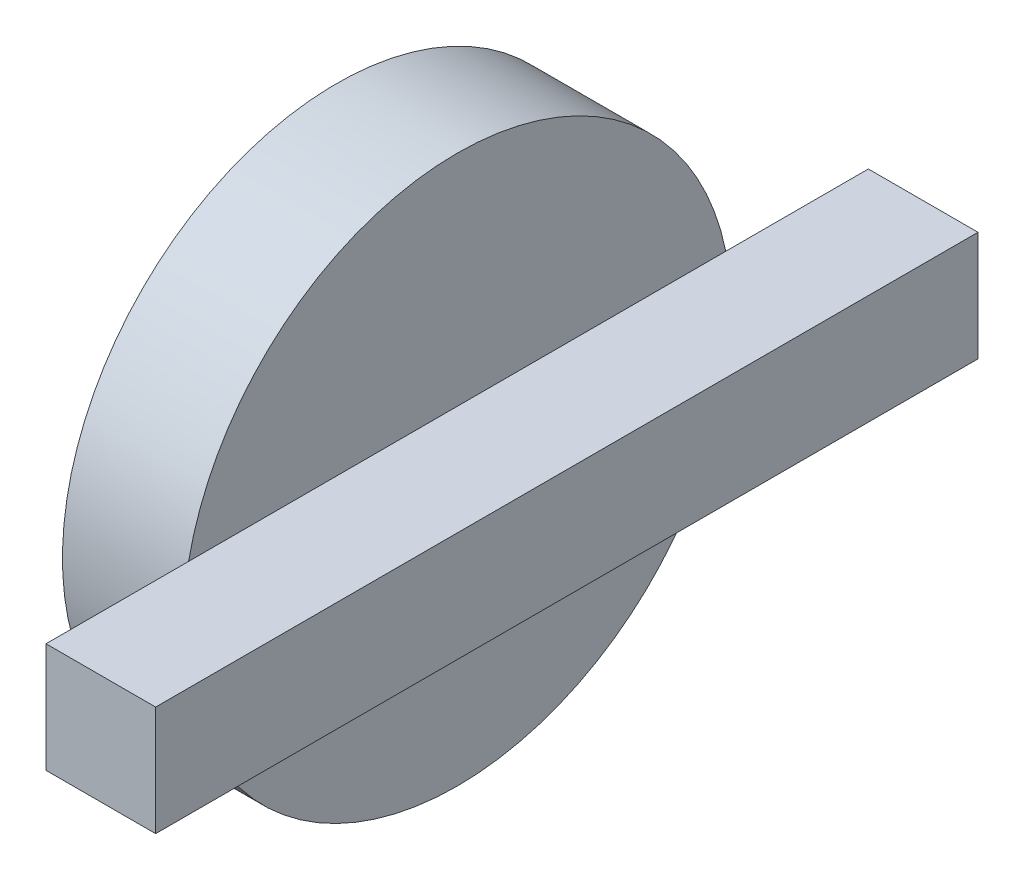
ISO-10303-21;
HEADER;
FILE_DESCRIPTION(('STEP AP214'),'2;1');
FILE_NAME('part.step','',(''),(''),'','','');
FILE_SCHEMA(('AUTOMOTIVE_DESIGN { 1 0 10303 214 1 1 1 1 }'));
ENDSEC;
DATA;
#1=APPLICATION_CONTEXT('core data for automotive mechanical design processes');
#2=APPLICATION_PROTOCOL_DEFINITION('international standard','automotive_design',2000,#1);
#3=PRODUCT_CONTEXT('',#1,'mechanical');
#4=PRODUCT('Part','Part','',(#3));
#5=PRODUCT_RELATED_PRODUCT_CATEGORY('part','',(#4));
#6=PRODUCT_DEFINITION_FORMATION('','',#4);
#7=PRODUCT_DEFINITION_CONTEXT('part definition',#1,'design');
#8=PRODUCT_DEFINITION('design','',#6,#7);
#9=PRODUCT_DEFINITION_SHAPE('','',#8);
#10=(LENGTH_UNIT() NAMED_UNIT(*) SI_UNIT(.MILLI.,.METRE.));
#11=(NAMED_UNIT(*) PLANE_ANGLE_UNIT() SI_UNIT($,.RADIAN.));
#12=(NAMED_UNIT(*) SI_UNIT($,.STERADIAN.) SOLID_ANGLE_UNIT());
#13=UNCERTAINTY_MEASURE_WITH_UNIT(LENGTH_MEASURE(1.E-05),#10,'distance_accuracy_value','');
#14=(GEOMETRIC_REPRESENTATION_CONTEXT(3) GLOBAL_UNCERTAINTY_ASSIGNED_CONTEXT((#13)) GLOBAL_UNIT_ASSIGNED_CONTEXT((#10,
#11,#12)) REPRESENTATION_CONTEXT('',''));
#15=CARTESIAN_POINT('',(0.,0.,0.));
#16=DIRECTION('',(0.,0.,1.));
#17=DIRECTION('',(1.,0.,0.));
#18=AXIS2_PLACEMENT_3D('',#15,#16,#17);
#19=CARTESIAN_POINT('',(11.,0.,0.));
#20=DIRECTION('',(1.,0.,0.));
#21=DIRECTION('',(0.,0.,-1.));
#22=AXIS2_PLACEMENT_3D('',#19,#20,#21);
#23=PLANE('',#22);
#24=DIRECTION('',(0.,0.,1.));
#25=VECTOR('',#24,1.);
#26=CARTESIAN_POINT('',(11.,9.99999999999998,75.));
#27=LINE('',#26,#25);
#28=CARTESIAN_POINT('',(11.,10.,-48.9897948556636));
#29=VERTEX_POINT('',#28);
#30=CARTESIAN_POINT('',(11.,9.99999999999998,48.9897948556636));
#31=VERTEX_POINT('',#30);
#32=EDGE_CURVE('E11',#29,#31,#27,.T.);
#33=ORIENTED_EDGE('',*,*,#32,.F.);
#34=CARTESIAN_POINT('',(11.,0.,0.));
#35=DIRECTION('',(1.,0.,0.));
#36=DIRECTION('',(0.,0.,-1.));
#37=AXIS2_PLACEMENT_3D('',#34,#35,#36);
#38=CIRCLE('',#37,50.);
#39=EDGE_CURVE('E142',#29,#31,#38,.T.);
#40=ORIENTED_EDGE('',*,*,#39,.T.);
#41=EDGE_LOOP('',(#33,#40));
#42=FACE_BOUND('',#41,.T.);
#43=ADVANCED_FACE('F43',(#42),#23,.T.);
#44=CARTESIAN_POINT('',(11.,0.,0.));
#45=DIRECTION('',(-1.,0.,0.));
#46=DIRECTION('',(0.,0.,1.));
#47=AXIS2_PLACEMENT_3D('',#44,#45,#46);
#48=CYLINDRICAL_SURFACE('',#47,50.);
#49=ORIENTED_EDGE('',*,*,#39,.F.);
#50=CARTESIAN_POINT('',(11.,-10.,-48.9897948556636));
#51=VERTEX_POINT('',#50);
#52=EDGE_CURVE('E144',#51,#29,#38,.T.);
#53=ORIENTED_EDGE('',*,*,#52,.F.);
#54=CARTESIAN_POINT('',(11.,-10.,48.9897948556636));
#55=VERTEX_POINT('',#54);
#56=EDGE_CURVE('E152',#55,#51,#38,.T.);
#57=ORIENTED_EDGE('',*,*,#56,.F.);
#58=EDGE_CURVE('E68',#31,#55,#38,.T.);
#59=ORIENTED_EDGE('',*,*,#58,.F.);
#60=EDGE_LOOP('',(#49,#53,#57,#59));
#61=FACE_BOUND('',#60,.T.);
#62=CARTESIAN_POINT('',(-11.,0.,0.));
#63=DIRECTION('',(1.,0.,0.));
#64=DIRECTION('',(0.,0.,-1.));
#65=AXIS2_PLACEMENT_3D('',#62,#63,#64);
#66=CIRCLE('',#65,50.);
#67=CARTESIAN_POINT('',(-11.,0.,-50.));
#68=VERTEX_POINT('',#67);
#69=EDGE_CURVE('E47',#68,#68,#66,.T.);
#70=ORIENTED_EDGE('',*,*,#69,.T.);
#71=EDGE_LOOP('',(#70));
#72=FACE_BOUND('',#71,.T.);
#73=ADVANCED_FACE('F45',(#61,#72),#48,.T.);
#74=DIRECTION('',(0.,0.,-1.));
#75=VECTOR('',#74,1.);
#76=CARTESIAN_POINT('',(11.,-10.,75.));
#77=LINE('',#76,#75);
#78=EDGE_CURVE('E53',#55,#51,#77,.T.);
#79=ORIENTED_EDGE('',*,*,#78,.F.);
#80=ORIENTED_EDGE('',*,*,#56,.T.);
#81=EDGE_LOOP('',(#79,#80));
#82=FACE_BOUND('',#81,.T.);
#83=ADVANCED_FACE('F169',(#82),#23,.T.);
#84=CARTESIAN_POINT('',(-11.,0.,0.));
#85=DIRECTION('',(1.,0.,0.));
#86=DIRECTION('',(0.,0.,-1.));
#87=AXIS2_PLACEMENT_3D('',#84,#85,#86);
#88=PLANE('',#87);
#89=CARTESIAN_POINT('',(-11.,0.,0.));
#90=DIRECTION('',(-1.,0.,0.));
#91=DIRECTION('',(0.,0.,1.));
#92=AXIS2_PLACEMENT_3D('',#89,#90,#91);
#93=CIRCLE('',#92,30.);
#94=CARTESIAN_POINT('',(-11.,0.,30.));
#95=VERTEX_POINT('',#94);
#96=EDGE_CURVE('E129',#95,#95,#93,.T.);
#97=ORIENTED_EDGE('',*,*,#96,.F.);
#98=EDGE_LOOP('',(#97));
#99=FACE_BOUND('',#98,.T.);
#100=ORIENTED_EDGE('',*,*,#69,.F.);
#101=EDGE_LOOP('',(#100));
#102=FACE_BOUND('',#101,.T.);
#103=ADVANCED_FACE('F166',(#99,#102),#88,.F.);
#104=CARTESIAN_POINT('',(1.,0.,0.));
#105=DIRECTION('',(-1.,0.,0.));
#106=DIRECTION('',(0.,0.,1.));
#107=AXIS2_PLACEMENT_3D('',#104,#105,#106);
#108=CYLINDRICAL_SURFACE('',#107,30.);
#109=CARTESIAN_POINT('',(1.,0.,0.));
#110=DIRECTION('',(-1.,0.,0.));
#111=DIRECTION('',(0.,0.,1.));
#112=AXIS2_PLACEMENT_3D('',#109,#110,#111);
#113=CIRCLE('',#112,30.);
#114=CARTESIAN_POINT('',(1.,0.,30.));
#115=VERTEX_POINT('',#114);
#116=EDGE_CURVE('E134',#115,#115,#113,.T.);
#117=ORIENTED_EDGE('',*,*,#116,.F.);
#118=EDGE_LOOP('',(#117));
#119=FACE_BOUND('',#118,.T.);
#120=ORIENTED_EDGE('',*,*,#96,.T.);
#121=EDGE_LOOP('',(#120));
#122=FACE_BOUND('',#121,.T.);
#123=ADVANCED_FACE('F168',(#119,#122),#108,.F.);
#124=CARTESIAN_POINT('',(1.,0.,0.));
#125=DIRECTION('',(-1.,0.,0.));
#126=DIRECTION('',(0.,0.,1.));
#127=AXIS2_PLACEMENT_3D('',#124,#125,#126);
#128=PLANE('',#127);
#129=ORIENTED_EDGE('',*,*,#116,.T.);
#130=EDGE_LOOP('',(#129));
#131=FACE_BOUND('',#130,.T.);
#132=ADVANCED_FACE('F175',(#131),#128,.T.);
#133=CARTESIAN_POINT('',(11.,0.,0.));
#134=DIRECTION('',(1.,0.,0.));
#135=DIRECTION('',(0.,0.,-1.));
#136=AXIS2_PLACEMENT_3D('',#133,#134,#135);
#137=PLANE('',#136);
#138=CARTESIAN_POINT('',(11.,9.99999999999998,75.));
#139=VERTEX_POINT('',#138);
#140=EDGE_CURVE('E56',#31,#139,#27,.T.);
#141=ORIENTED_EDGE('',*,*,#140,.F.);
#142=ORIENTED_EDGE('',*,*,#58,.T.);
#143=CARTESIAN_POINT('',(11.,-10.,75.));
#144=VERTEX_POINT('',#143);
#145=EDGE_CURVE('E150',#144,#55,#77,.T.);
#146=ORIENTED_EDGE('',*,*,#145,.F.);
#147=DIRECTION('',(0.,-1.,0.));
#148=VECTOR('',#147,1.);
#149=CARTESIAN_POINT('',(11.,9.99999999999998,75.));
#150=LINE('',#149,#148);
#151=EDGE_CURVE('E127',#139,#144,#150,.T.);
#152=ORIENTED_EDGE('',*,*,#151,.F.);
#153=EDGE_LOOP('',(#141,#142,#146,#152));
#154=FACE_BOUND('',#153,.T.);
#155=ADVANCED_FACE('F187',(#154),#137,.F.);
#156=CARTESIAN_POINT('',(11.,-10.,-75.));
#157=VERTEX_POINT('',#156);
#158=EDGE_CURVE('E151',#51,#157,#77,.T.);
#159=ORIENTED_EDGE('',*,*,#158,.F.);
#160=ORIENTED_EDGE('',*,*,#52,.T.);
#161=CARTESIAN_POINT('',(11.,10.,-75.));
#162=VERTEX_POINT('',#161);
#163=EDGE_CURVE('E55',#162,#29,#27,.T.);
#164=ORIENTED_EDGE('',*,*,#163,.F.);
#165=DIRECTION('',(0.,1.,0.));
#166=VECTOR('',#165,1.);
#167=CARTESIAN_POINT('',(11.,10.,-75.));
#168=LINE('',#167,#166);
#169=EDGE_CURVE('E308',#157,#162,#168,.T.);
#170=ORIENTED_EDGE('',*,*,#169,.F.);
#171=EDGE_LOOP('',(#159,#160,#164,#170));
#172=FACE_BOUND('',#171,.T.);
#173=ADVANCED_FACE('F191',(#172),#137,.F.);
#174=CARTESIAN_POINT('',(31.,9.99999999999998,75.));
#175=DIRECTION('',(0.,0.,-1.));
#176=DIRECTION('',(-1.,0.,0.));
#177=AXIS2_PLACEMENT_3D('',#174,#175,#176);
#178=PLANE('',#177);
#179=ORIENTED_EDGE('',*,*,#151,.T.);
#180=DIRECTION('',(-1.,0.,0.));
#181=VECTOR('',#180,1.);
#182=CARTESIAN_POINT('',(31.,-10.,75.));
#183=LINE('',#182,#181);
#184=CARTESIAN_POINT('',(31.,-10.,75.));
#185=VERTEX_POINT('',#184);
#186=EDGE_CURVE('E106',#185,#144,#183,.T.);
#187=ORIENTED_EDGE('',*,*,#186,.F.);
#188=DIRECTION('',(0.,-1.,0.));
#189=VECTOR('',#188,1.);
#190=CARTESIAN_POINT('',(31.,9.99999999999998,75.));
#191=LINE('',#190,#189);
#192=CARTESIAN_POINT('',(31.,9.99999999999998,75.));
#193=VERTEX_POINT('',#192);
#194=EDGE_CURVE('E114',#193,#185,#191,.T.);
#195=ORIENTED_EDGE('',*,*,#194,.F.);
#196=DIRECTION('',(-1.,0.,0.));
#197=VECTOR('',#196,1.);
#198=CARTESIAN_POINT('',(31.,9.99999999999998,75.));
#199=LINE('',#198,#197);
#200=EDGE_CURVE('E317',#193,#139,#199,.T.);
#201=ORIENTED_EDGE('',*,*,#200,.T.);
#202=EDGE_LOOP('',(#179,#187,#195,#201));
#203=FACE_BOUND('',#202,.T.);
#204=ADVANCED_FACE('F125',(#203),#178,.F.);
#205=CARTESIAN_POINT('',(31.,-10.,75.));
#206=DIRECTION('',(0.,1.,0.));
#207=DIRECTION('',(0.,0.,1.));
#208=AXIS2_PLACEMENT_3D('',#205,#206,#207);
#209=PLANE('',#208);
#210=ORIENTED_EDGE('',*,*,#145,.T.);
#211=ORIENTED_EDGE('',*,*,#78,.T.);
#212=ORIENTED_EDGE('',*,*,#158,.T.);
#213=DIRECTION('',(-1.,0.,0.));
#214=VECTOR('',#213,1.);
#215=CARTESIAN_POINT('',(31.,-10.,-75.));
#216=LINE('',#215,#214);
#217=CARTESIAN_POINT('',(31.,-10.,-75.));
#218=VERTEX_POINT('',#217);
#219=EDGE_CURVE('E109',#218,#157,#216,.T.);
#220=ORIENTED_EDGE('',*,*,#219,.F.);
#221=DIRECTION('',(0.,0.,-1.));
#222=VECTOR('',#221,1.);
#223=CARTESIAN_POINT('',(31.,-10.,75.));
#224=LINE('',#223,#222);
#225=EDGE_CURVE('E101',#185,#218,#224,.T.);
#226=ORIENTED_EDGE('',*,*,#225,.F.);
#227=ORIENTED_EDGE('',*,*,#186,.T.);
#228=EDGE_LOOP('',(#210,#211,#212,#220,#226,#227));
#229=FACE_BOUND('',#228,.T.);
#230=ADVANCED_FACE('F104',(#229),#209,.F.);
#231=CARTESIAN_POINT('',(31.,10.,-75.));
#232=DIRECTION('',(0.,0.,1.));
#233=DIRECTION('',(1.,0.,0.));
#234=AXIS2_PLACEMENT_3D('',#231,#232,#233);
#235=PLANE('',#234);
#236=ORIENTED_EDGE('',*,*,#169,.T.);
#237=DIRECTION('',(-1.,0.,0.));
#238=VECTOR('',#237,1.);
#239=CARTESIAN_POINT('',(31.,10.,-75.));
#240=LINE('',#239,#238);
#241=CARTESIAN_POINT('',(31.,10.,-75.));
#242=VERTEX_POINT('',#241);
#243=EDGE_CURVE('E136',#242,#162,#240,.T.);
#244=ORIENTED_EDGE('',*,*,#243,.F.);
#245=DIRECTION('',(0.,1.,0.));
#246=VECTOR('',#245,1.);
#247=CARTESIAN_POINT('',(31.,10.,-75.));
#248=LINE('',#247,#246);
#249=EDGE_CURVE('E113',#218,#242,#248,.T.);
#250=ORIENTED_EDGE('',*,*,#249,.F.);
#251=ORIENTED_EDGE('',*,*,#219,.T.);
#252=EDGE_LOOP('',(#236,#244,#250,#251));
#253=FACE_BOUND('',#252,.T.);
#254=ADVANCED_FACE('F194',(#253),#235,.F.);
#255=CARTESIAN_POINT('',(31.,9.99999999999998,75.));
#256=DIRECTION('',(0.,-1.,0.));
#257=DIRECTION('',(0.,0.,-1.));
#258=AXIS2_PLACEMENT_3D('',#255,#256,#257);
#259=PLANE('',#258);
#260=ORIENTED_EDGE('',*,*,#163,.T.);
#261=ORIENTED_EDGE('',*,*,#32,.T.);
#262=ORIENTED_EDGE('',*,*,#140,.T.);
#263=ORIENTED_EDGE('',*,*,#200,.F.);
#264=DIRECTION('',(0.,0.,1.));
#265=VECTOR('',#264,1.);
#266=CARTESIAN_POINT('',(31.,9.99999999999998,75.));
#267=LINE('',#266,#265);
#268=EDGE_CURVE('E119',#242,#193,#267,.T.);
#269=ORIENTED_EDGE('',*,*,#268,.F.);
#270=ORIENTED_EDGE('',*,*,#243,.T.);
#271=EDGE_LOOP('',(#260,#261,#262,#263,#269,#270));
#272=FACE_BOUND('',#271,.T.);
#273=ADVANCED_FACE('F197',(#272),#259,.F.);
#274=CARTESIAN_POINT('',(31.,0.,0.));
#275=DIRECTION('',(1.,0.,0.));
#276=DIRECTION('',(0.,0.,-1.));
#277=AXIS2_PLACEMENT_3D('',#274,#275,#276);
#278=PLANE('',#277);
#279=ORIENTED_EDGE('',*,*,#194,.T.);
#280=ORIENTED_EDGE('',*,*,#225,.T.);
#281=ORIENTED_EDGE('',*,*,#249,.T.);
#282=ORIENTED_EDGE('',*,*,#268,.T.);
#283=EDGE_LOOP('',(#279,#280,#281,#282));
#284=FACE_BOUND('',#283,.T.);
#285=ADVANCED_FACE('F117',(#284),#278,.T.);
#286=CLOSED_SHELL('',(#43,#73,#83,#103,#123,#132,#155,#173,#204,#230,#254,#273,#285));
#287=MANIFOLD_SOLID_BREP('B2',#286);
#288=ADVANCED_BREP_SHAPE_REPRESENTATION('',(#18,#287),#14);
#289=SHAPE_DEFINITION_REPRESENTATION(#9,#288);
ENDSEC;
END-ISO-10303-21;
